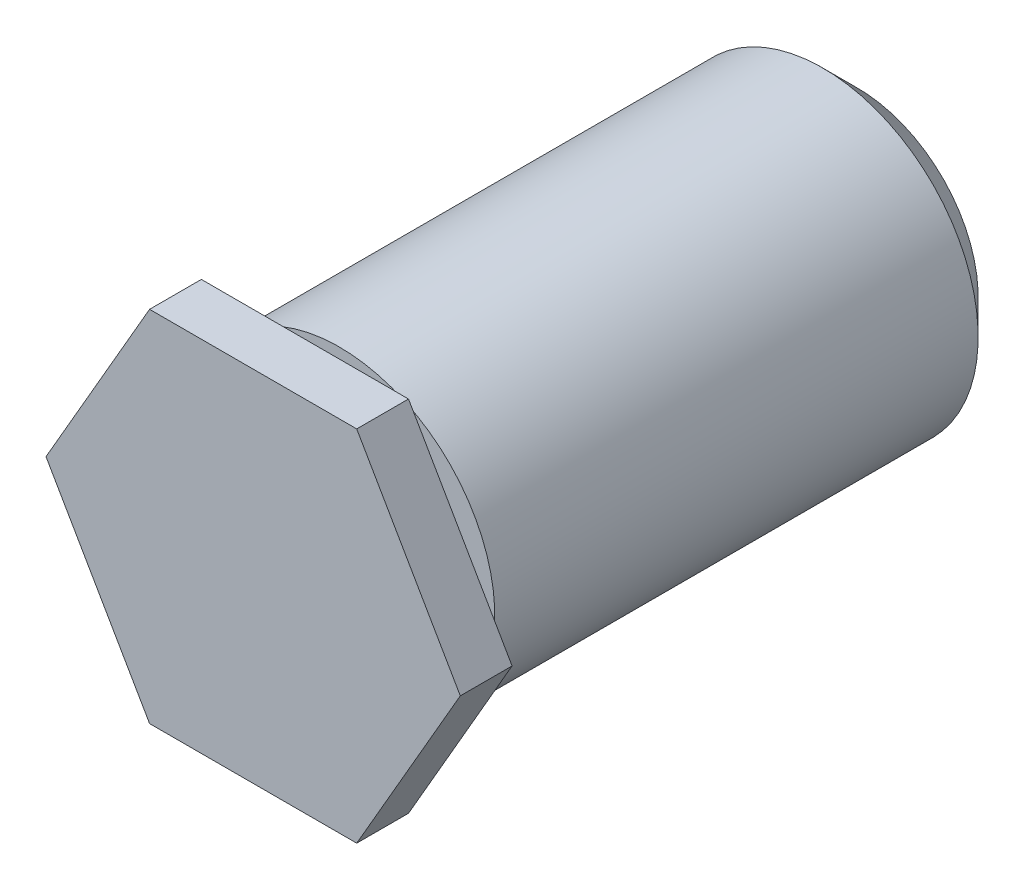
ISO-10303-21;
HEADER;
FILE_DESCRIPTION(('STEP AP214'),'2;1');
FILE_NAME('part.step','',(''),(''),'','','');
FILE_SCHEMA(('AUTOMOTIVE_DESIGN { 1 0 10303 214 1 1 1 1 }'));
ENDSEC;
DATA;
#1=APPLICATION_CONTEXT('core data for automotive mechanical design processes');
#2=APPLICATION_PROTOCOL_DEFINITION('international standard','automotive_design',2000,#1);
#3=PRODUCT_CONTEXT('',#1,'mechanical');
#4=PRODUCT('Part','Part','',(#3));
#5=PRODUCT_RELATED_PRODUCT_CATEGORY('part','',(#4));
#6=PRODUCT_DEFINITION_FORMATION('','',#4);
#7=PRODUCT_DEFINITION_CONTEXT('part definition',#1,'design');
#8=PRODUCT_DEFINITION('design','',#6,#7);
#9=PRODUCT_DEFINITION_SHAPE('','',#8);
#10=(LENGTH_UNIT() NAMED_UNIT(*) SI_UNIT(.MILLI.,.METRE.));
#11=(NAMED_UNIT(*) PLANE_ANGLE_UNIT() SI_UNIT($,.RADIAN.));
#12=(NAMED_UNIT(*) SI_UNIT($,.STERADIAN.) SOLID_ANGLE_UNIT());
#13=UNCERTAINTY_MEASURE_WITH_UNIT(LENGTH_MEASURE(1.E-05),#10,'distance_accuracy_value','');
#14=(GEOMETRIC_REPRESENTATION_CONTEXT(3) GLOBAL_UNCERTAINTY_ASSIGNED_CONTEXT((#13)) GLOBAL_UNIT_ASSIGNED_CONTEXT((#10,
#11,#12)) REPRESENTATION_CONTEXT('',''));
#15=CARTESIAN_POINT('',(0.,0.,0.));
#16=DIRECTION('',(0.,0.,1.));
#17=DIRECTION('',(1.,0.,0.));
#18=AXIS2_PLACEMENT_3D('',#15,#16,#17);
#19=CARTESIAN_POINT('',(16.,-4.50303352906477E-13,0.));
#20=DIRECTION('',(0.,0.,1.));
#21=DIRECTION('',(1.,0.,0.));
#22=AXIS2_PLACEMENT_3D('',#19,#20,#21);
#23=PLANE('',#22);
#24=DIRECTION('',(-0.499999999999988,0.866025403784446,0.));
#25=VECTOR('',#24,1.);
#26=CARTESIAN_POINT('',(12.,-3.39287716901434E-13,0.));
#27=LINE('',#26,#25);
#28=CARTESIAN_POINT('',(12.,-3.39287716901434E-13,0.));
#29=VERTEX_POINT('',#28);
#30=CARTESIAN_POINT('',(5.99999999999998,10.3923048454133,0.));
#31=VERTEX_POINT('',#30);
#32=EDGE_CURVE('E126',#29,#31,#27,.T.);
#33=ORIENTED_EDGE('',*,*,#32,.F.);
#34=DIRECTION('',(0.500000000000006,0.866025403784435,0.));
#35=VECTOR('',#34,1.);
#36=CARTESIAN_POINT('',(6.00000000000012,-10.3923048454132,0.));
#37=LINE('',#36,#35);
#38=CARTESIAN_POINT('',(6.00000000000012,-10.3923048454132,0.));
#39=VERTEX_POINT('',#38);
#40=EDGE_CURVE('E92',#39,#29,#37,.T.);
#41=ORIENTED_EDGE('',*,*,#40,.F.);
#42=DIRECTION('',(1.,0.,0.));
#43=VECTOR('',#42,1.);
#44=CARTESIAN_POINT('',(-5.9999999999999,-10.3923048454133,0.));
#45=LINE('',#44,#43);
#46=CARTESIAN_POINT('',(-5.9999999999999,-10.3923048454133,0.));
#47=VERTEX_POINT('',#46);
#48=EDGE_CURVE('E112',#47,#39,#45,.T.);
#49=ORIENTED_EDGE('',*,*,#48,.F.);
#50=DIRECTION('',(0.500000000000007,-0.866025403784434,0.));
#51=VECTOR('',#50,1.);
#52=CARTESIAN_POINT('',(-12.,0.,0.));
#53=LINE('',#52,#51);
#54=CARTESIAN_POINT('',(-12.,0.,0.));
#55=VERTEX_POINT('',#54);
#56=EDGE_CURVE('E60',#55,#47,#53,.T.);
#57=ORIENTED_EDGE('',*,*,#56,.F.);
#58=DIRECTION('',(-0.499999999999995,-0.866025403784441,0.));
#59=VECTOR('',#58,1.);
#60=CARTESIAN_POINT('',(-6.00000000000005,10.3923048454132,0.));
#61=LINE('',#60,#59);
#62=CARTESIAN_POINT('',(-6.00000000000005,10.3923048454132,0.));
#63=VERTEX_POINT('',#62);
#64=EDGE_CURVE('E131',#63,#55,#61,.T.);
#65=ORIENTED_EDGE('',*,*,#64,.F.);
#66=DIRECTION('',(-1.,0.,0.));
#67=VECTOR('',#66,1.);
#68=CARTESIAN_POINT('',(5.99999999999998,10.3923048454133,0.));
#69=LINE('',#68,#67);
#70=EDGE_CURVE('E128',#31,#63,#69,.T.);
#71=ORIENTED_EDGE('',*,*,#70,.F.);
#72=EDGE_LOOP('',(#33,#41,#49,#57,#65,#71));
#73=FACE_BOUND('',#72,.T.);
#74=CARTESIAN_POINT('',(0.,-4.5252818282491E-13,0.));
#75=DIRECTION('',(0.,0.,-1.));
#76=DIRECTION('',(-1.,0.,0.));
#77=AXIS2_PLACEMENT_3D('',#74,#75,#76);
#78=CIRCLE('',#77,7.);
#79=CARTESIAN_POINT('',(-7.,-4.5252818282491E-13,0.));
#80=VERTEX_POINT('',#79);
#81=EDGE_CURVE('E11',#80,#80,#78,.T.);
#82=ORIENTED_EDGE('',*,*,#81,.F.);
#83=EDGE_LOOP('',(#82));
#84=FACE_BOUND('',#83,.T.);
#85=ADVANCED_FACE('F38',(#73,#84),#23,.F.);
#86=CARTESIAN_POINT('',(0.,-4.5252818282491E-13,-32.));
#87=DIRECTION('',(0.,0.,-1.));
#88=DIRECTION('',(-1.,0.,0.));
#89=AXIS2_PLACEMENT_3D('',#86,#87,#88);
#90=CYLINDRICAL_SURFACE('',#89,7.);
#91=ORIENTED_EDGE('',*,*,#81,.T.);
#92=EDGE_LOOP('',(#91));
#93=FACE_BOUND('',#92,.T.);
#94=CARTESIAN_POINT('',(0.,-4.5252818282491E-13,-2.));
#95=DIRECTION('',(0.,0.,-1.));
#96=DIRECTION('',(-1.,0.,0.));
#97=AXIS2_PLACEMENT_3D('',#94,#95,#96);
#98=CIRCLE('',#97,7.);
#99=CARTESIAN_POINT('',(-7.,-4.5252818282491E-13,-2.));
#100=VERTEX_POINT('',#99);
#101=EDGE_CURVE('E45',#100,#100,#98,.T.);
#102=ORIENTED_EDGE('',*,*,#101,.F.);
#103=EDGE_LOOP('',(#102));
#104=FACE_BOUND('',#103,.T.);
#105=ADVANCED_FACE('F156',(#93,#104),#90,.T.);
#106=CARTESIAN_POINT('',(0.,6.99999999999955,-2.));
#107=DIRECTION('',(0.,0.,1.));
#108=DIRECTION('',(1.,0.,0.));
#109=AXIS2_PLACEMENT_3D('',#106,#107,#108);
#110=PLANE('',#109);
#111=ORIENTED_EDGE('',*,*,#101,.T.);
#112=EDGE_LOOP('',(#111));
#113=FACE_BOUND('',#112,.T.);
#114=CARTESIAN_POINT('',(0.,-4.5252818282491E-13,-2.));
#115=DIRECTION('',(0.,0.,-1.));
#116=DIRECTION('',(-1.,0.,0.));
#117=AXIS2_PLACEMENT_3D('',#114,#115,#116);
#118=CIRCLE('',#117,9.);
#119=CARTESIAN_POINT('',(-9.,-4.5252818282491E-13,-2.));
#120=VERTEX_POINT('',#119);
#121=EDGE_CURVE('E148',#120,#120,#118,.T.);
#122=ORIENTED_EDGE('',*,*,#121,.F.);
#123=EDGE_LOOP('',(#122));
#124=FACE_BOUND('',#123,.T.);
#125=ADVANCED_FACE('F153',(#113,#124),#110,.T.);
#126=CARTESIAN_POINT('',(0.,-4.5252818282491E-13,-32.));
#127=DIRECTION('',(0.,0.,-1.));
#128=DIRECTION('',(-1.,0.,0.));
#129=AXIS2_PLACEMENT_3D('',#126,#127,#128);
#130=CYLINDRICAL_SURFACE('',#129,9.);
#131=ORIENTED_EDGE('',*,*,#121,.T.);
#132=EDGE_LOOP('',(#131));
#133=FACE_BOUND('',#132,.T.);
#134=CARTESIAN_POINT('',(0.,-4.5252818282491E-13,-30.));
#135=DIRECTION('',(0.,0.,-1.));
#136=DIRECTION('',(-1.,0.,0.));
#137=AXIS2_PLACEMENT_3D('',#134,#135,#136);
#138=CIRCLE('',#137,9.);
#139=CARTESIAN_POINT('',(-9.,-4.5252818282491E-13,-30.));
#140=VERTEX_POINT('',#139);
#141=EDGE_CURVE('E145',#140,#140,#138,.T.);
#142=ORIENTED_EDGE('',*,*,#141,.F.);
#143=EDGE_LOOP('',(#142));
#144=FACE_BOUND('',#143,.T.);
#145=ADVANCED_FACE('F164',(#133,#144),#130,.T.);
#146=CARTESIAN_POINT('',(0.,-4.5252818282491E-13,-32.));
#147=DIRECTION('',(0.,0.,1.));
#148=DIRECTION('',(1.,0.,0.));
#149=AXIS2_PLACEMENT_3D('',#146,#147,#148);
#150=CONICAL_SURFACE('',#149,7.,0.785398163397448);
#151=ORIENTED_EDGE('',*,*,#141,.T.);
#152=EDGE_LOOP('',(#151));
#153=FACE_BOUND('',#152,.T.);
#154=CARTESIAN_POINT('',(0.,-4.5252818282491E-13,-32.));
#155=DIRECTION('',(0.,0.,-1.));
#156=DIRECTION('',(-1.,0.,0.));
#157=AXIS2_PLACEMENT_3D('',#154,#155,#156);
#158=CIRCLE('',#157,7.);
#159=CARTESIAN_POINT('',(-7.,-4.5252818282491E-13,-32.));
#160=VERTEX_POINT('',#159);
#161=EDGE_CURVE('E96',#160,#160,#158,.T.);
#162=ORIENTED_EDGE('',*,*,#161,.F.);
#163=EDGE_LOOP('',(#162));
#164=FACE_BOUND('',#163,.T.);
#165=ADVANCED_FACE('F196',(#153,#164),#150,.T.);
#166=CARTESIAN_POINT('',(0.,6.99999999999955,-32.));
#167=DIRECTION('',(0.,0.,-1.));
#168=DIRECTION('',(-1.,0.,0.));
#169=AXIS2_PLACEMENT_3D('',#166,#167,#168);
#170=PLANE('',#169);
#171=ORIENTED_EDGE('',*,*,#161,.T.);
#172=EDGE_LOOP('',(#171));
#173=FACE_BOUND('',#172,.T.);
#174=ADVANCED_FACE('F193',(#173),#170,.T.);
#175=CARTESIAN_POINT('',(6.00000000000012,-10.3923048454132,3.));
#176=DIRECTION('',(-0.866025403784435,0.500000000000006,0.));
#177=DIRECTION('',(-0.500000000000006,-0.866025403784435,0.));
#178=AXIS2_PLACEMENT_3D('',#175,#176,#177);
#179=PLANE('',#178);
#180=ORIENTED_EDGE('',*,*,#40,.T.);
#181=DIRECTION('',(0.,0.,-1.));
#182=VECTOR('',#181,1.);
#183=CARTESIAN_POINT('',(12.,-3.39287716901434E-13,3.));
#184=LINE('',#183,#182);
#185=CARTESIAN_POINT('',(12.,-3.39287716901434E-13,3.));
#186=VERTEX_POINT('',#185);
#187=EDGE_CURVE('E88',#186,#29,#184,.T.);
#188=ORIENTED_EDGE('',*,*,#187,.F.);
#189=DIRECTION('',(0.500000000000006,0.866025403784435,0.));
#190=VECTOR('',#189,1.);
#191=CARTESIAN_POINT('',(6.00000000000012,-10.3923048454132,3.));
#192=LINE('',#191,#190);
#193=CARTESIAN_POINT('',(6.00000000000012,-10.3923048454132,3.));
#194=VERTEX_POINT('',#193);
#195=EDGE_CURVE('E52',#194,#186,#192,.T.);
#196=ORIENTED_EDGE('',*,*,#195,.F.);
#197=DIRECTION('',(0.,0.,-1.));
#198=VECTOR('',#197,1.);
#199=CARTESIAN_POINT('',(6.00000000000012,-10.3923048454132,3.));
#200=LINE('',#199,#198);
#201=EDGE_CURVE('E124',#194,#39,#200,.T.);
#202=ORIENTED_EDGE('',*,*,#201,.T.);
#203=EDGE_LOOP('',(#180,#188,#196,#202));
#204=FACE_BOUND('',#203,.T.);
#205=ADVANCED_FACE('F90',(#204),#179,.F.);
#206=CARTESIAN_POINT('',(12.,-3.39287716901434E-13,3.));
#207=DIRECTION('',(-0.866025403784445,-0.499999999999988,0.));
#208=DIRECTION('',(0.499999999999988,-0.866025403784446,0.));
#209=AXIS2_PLACEMENT_3D('',#206,#207,#208);
#210=PLANE('',#209);
#211=ORIENTED_EDGE('',*,*,#32,.T.);
#212=DIRECTION('',(0.,0.,-1.));
#213=VECTOR('',#212,1.);
#214=CARTESIAN_POINT('',(5.99999999999998,10.3923048454133,3.));
#215=LINE('',#214,#213);
#216=CARTESIAN_POINT('',(5.99999999999998,10.3923048454133,3.));
#217=VERTEX_POINT('',#216);
#218=EDGE_CURVE('E97',#217,#31,#215,.T.);
#219=ORIENTED_EDGE('',*,*,#218,.F.);
#220=DIRECTION('',(-0.499999999999988,0.866025403784446,0.));
#221=VECTOR('',#220,1.);
#222=CARTESIAN_POINT('',(12.,-3.39287716901434E-13,3.));
#223=LINE('',#222,#221);
#224=EDGE_CURVE('E100',#186,#217,#223,.T.);
#225=ORIENTED_EDGE('',*,*,#224,.F.);
#226=ORIENTED_EDGE('',*,*,#187,.T.);
#227=EDGE_LOOP('',(#211,#219,#225,#226));
#228=FACE_BOUND('',#227,.T.);
#229=ADVANCED_FACE('F101',(#228),#210,.F.);
#230=CARTESIAN_POINT('',(5.99999999999998,10.3923048454133,3.));
#231=DIRECTION('',(0.,-1.,0.));
#232=DIRECTION('',(1.,0.,0.));
#233=AXIS2_PLACEMENT_3D('',#230,#231,#232);
#234=PLANE('',#233);
#235=ORIENTED_EDGE('',*,*,#70,.T.);
#236=DIRECTION('',(0.,0.,-1.));
#237=VECTOR('',#236,1.);
#238=CARTESIAN_POINT('',(-6.00000000000005,10.3923048454132,3.));
#239=LINE('',#238,#237);
#240=CARTESIAN_POINT('',(-6.00000000000005,10.3923048454132,3.));
#241=VERTEX_POINT('',#240);
#242=EDGE_CURVE('E140',#241,#63,#239,.T.);
#243=ORIENTED_EDGE('',*,*,#242,.F.);
#244=DIRECTION('',(-1.,0.,0.));
#245=VECTOR('',#244,1.);
#246=CARTESIAN_POINT('',(5.99999999999998,10.3923048454133,3.));
#247=LINE('',#246,#245);
#248=EDGE_CURVE('E105',#217,#241,#247,.T.);
#249=ORIENTED_EDGE('',*,*,#248,.F.);
#250=ORIENTED_EDGE('',*,*,#218,.T.);
#251=EDGE_LOOP('',(#235,#243,#249,#250));
#252=FACE_BOUND('',#251,.T.);
#253=ADVANCED_FACE('F184',(#252),#234,.F.);
#254=CARTESIAN_POINT('',(-6.00000000000005,10.3923048454132,3.));
#255=DIRECTION('',(0.866025403784441,-0.499999999999995,0.));
#256=DIRECTION('',(0.499999999999995,0.866025403784442,0.));
#257=AXIS2_PLACEMENT_3D('',#254,#255,#256);
#258=PLANE('',#257);
#259=ORIENTED_EDGE('',*,*,#64,.T.);
#260=DIRECTION('',(0.,0.,-1.));
#261=VECTOR('',#260,1.);
#262=CARTESIAN_POINT('',(-12.,0.,3.));
#263=LINE('',#262,#261);
#264=CARTESIAN_POINT('',(-12.,0.,3.));
#265=VERTEX_POINT('',#264);
#266=EDGE_CURVE('E138',#265,#55,#263,.T.);
#267=ORIENTED_EDGE('',*,*,#266,.F.);
#268=DIRECTION('',(-0.499999999999995,-0.866025403784441,0.));
#269=VECTOR('',#268,1.);
#270=CARTESIAN_POINT('',(-6.00000000000005,10.3923048454132,3.));
#271=LINE('',#270,#269);
#272=EDGE_CURVE('E118',#241,#265,#271,.T.);
#273=ORIENTED_EDGE('',*,*,#272,.F.);
#274=ORIENTED_EDGE('',*,*,#242,.T.);
#275=EDGE_LOOP('',(#259,#267,#273,#274));
#276=FACE_BOUND('',#275,.T.);
#277=ADVANCED_FACE('F179',(#276),#258,.F.);
#278=CARTESIAN_POINT('',(-12.,0.,3.));
#279=DIRECTION('',(0.866025403784435,0.500000000000007,0.));
#280=DIRECTION('',(-0.500000000000007,0.866025403784434,0.));
#281=AXIS2_PLACEMENT_3D('',#278,#279,#280);
#282=PLANE('',#281);
#283=ORIENTED_EDGE('',*,*,#56,.T.);
#284=DIRECTION('',(0.,0.,-1.));
#285=VECTOR('',#284,1.);
#286=CARTESIAN_POINT('',(-5.9999999999999,-10.3923048454133,3.));
#287=LINE('',#286,#285);
#288=CARTESIAN_POINT('',(-5.9999999999999,-10.3923048454133,3.));
#289=VERTEX_POINT('',#288);
#290=EDGE_CURVE('E136',#289,#47,#287,.T.);
#291=ORIENTED_EDGE('',*,*,#290,.F.);
#292=DIRECTION('',(0.500000000000007,-0.866025403784434,0.));
#293=VECTOR('',#292,1.);
#294=CARTESIAN_POINT('',(-12.,0.,3.));
#295=LINE('',#294,#293);
#296=EDGE_CURVE('E121',#265,#289,#295,.T.);
#297=ORIENTED_EDGE('',*,*,#296,.F.);
#298=ORIENTED_EDGE('',*,*,#266,.T.);
#299=EDGE_LOOP('',(#283,#291,#297,#298));
#300=FACE_BOUND('',#299,.T.);
#301=ADVANCED_FACE('F173',(#300),#282,.F.);
#302=CARTESIAN_POINT('',(-5.9999999999999,-10.3923048454133,3.));
#303=DIRECTION('',(0.,1.,0.));
#304=DIRECTION('',(-1.,0.,0.));
#305=AXIS2_PLACEMENT_3D('',#302,#303,#304);
#306=PLANE('',#305);
#307=ORIENTED_EDGE('',*,*,#48,.T.);
#308=ORIENTED_EDGE('',*,*,#201,.F.);
#309=DIRECTION('',(1.,0.,0.));
#310=VECTOR('',#309,1.);
#311=CARTESIAN_POINT('',(-5.9999999999999,-10.3923048454133,3.));
#312=LINE('',#311,#310);
#313=EDGE_CURVE('E111',#289,#194,#312,.T.);
#314=ORIENTED_EDGE('',*,*,#313,.F.);
#315=ORIENTED_EDGE('',*,*,#290,.T.);
#316=EDGE_LOOP('',(#307,#308,#314,#315));
#317=FACE_BOUND('',#316,.T.);
#318=ADVANCED_FACE('F169',(#317),#306,.F.);
#319=CARTESIAN_POINT('',(16.,-4.50303352906477E-13,3.));
#320=DIRECTION('',(0.,0.,1.));
#321=DIRECTION('',(1.,0.,0.));
#322=AXIS2_PLACEMENT_3D('',#319,#320,#321);
#323=PLANE('',#322);
#324=ORIENTED_EDGE('',*,*,#195,.T.);
#325=ORIENTED_EDGE('',*,*,#224,.T.);
#326=ORIENTED_EDGE('',*,*,#248,.T.);
#327=ORIENTED_EDGE('',*,*,#272,.T.);
#328=ORIENTED_EDGE('',*,*,#296,.T.);
#329=ORIENTED_EDGE('',*,*,#313,.T.);
#330=EDGE_LOOP('',(#324,#325,#326,#327,#328,#329));
#331=FACE_BOUND('',#330,.T.);
#332=ADVANCED_FACE('F108',(#331),#323,.T.);
#333=CLOSED_SHELL('',(#85,#105,#125,#145,#165,#174,#205,#229,#253,#277,#301,#318,#332));
#334=MANIFOLD_SOLID_BREP('B2',#333);
#335=ADVANCED_BREP_SHAPE_REPRESENTATION('',(#18,#334),#14);
#336=SHAPE_DEFINITION_REPRESENTATION(#9,#335);
ENDSEC;
END-ISO-10303-21;
